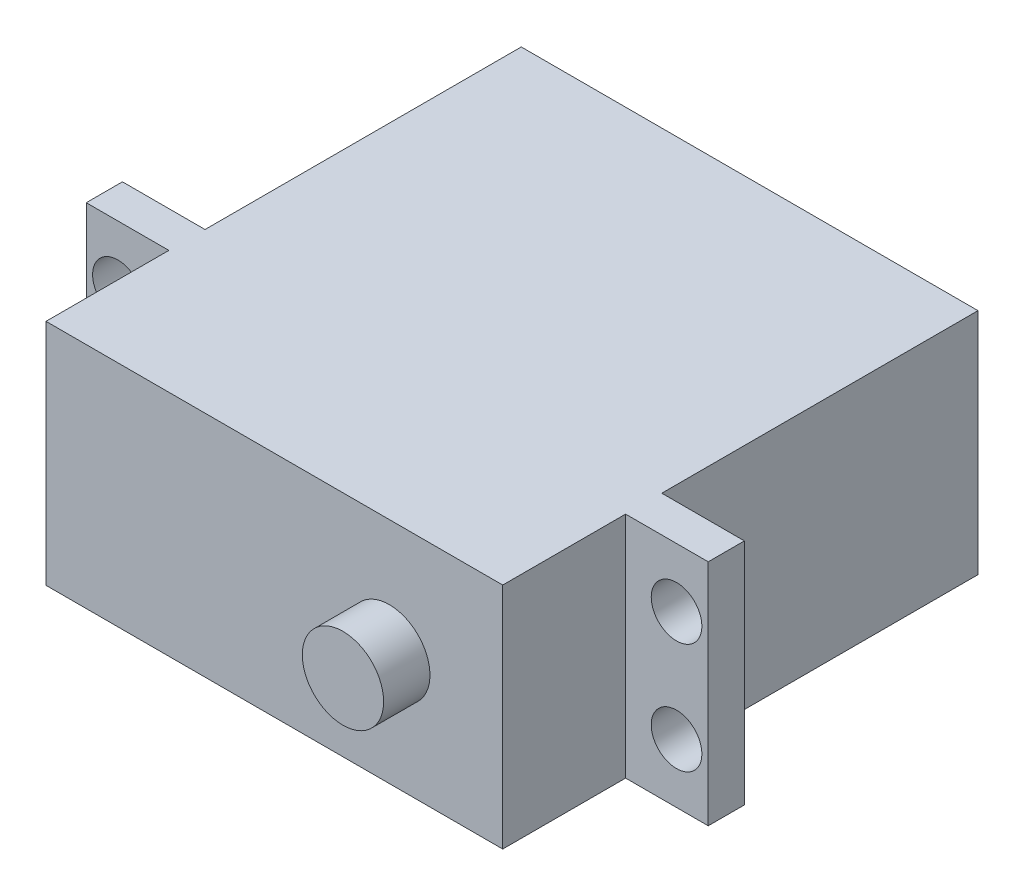
ISO-10303-21;
HEADER;
FILE_DESCRIPTION(('STEP AP214'),'2;1');
FILE_NAME('part.step','',(''),(''),'','','');
FILE_SCHEMA(('AUTOMOTIVE_DESIGN { 1 0 10303 214 1 1 1 1 }'));
ENDSEC;
DATA;
#1=APPLICATION_CONTEXT('core data for automotive mechanical design processes');
#2=APPLICATION_PROTOCOL_DEFINITION('international standard','automotive_design',2000,#1);
#3=PRODUCT_CONTEXT('',#1,'mechanical');
#4=PRODUCT('Part','Part','',(#3));
#5=PRODUCT_RELATED_PRODUCT_CATEGORY('part','',(#4));
#6=PRODUCT_DEFINITION_FORMATION('','',#4);
#7=PRODUCT_DEFINITION_CONTEXT('part definition',#1,'design');
#8=PRODUCT_DEFINITION('design','',#6,#7);
#9=PRODUCT_DEFINITION_SHAPE('','',#8);
#10=(LENGTH_UNIT() NAMED_UNIT(*) SI_UNIT(.MILLI.,.METRE.));
#11=(NAMED_UNIT(*) PLANE_ANGLE_UNIT() SI_UNIT($,.RADIAN.));
#12=(NAMED_UNIT(*) SI_UNIT($,.STERADIAN.) SOLID_ANGLE_UNIT());
#13=UNCERTAINTY_MEASURE_WITH_UNIT(LENGTH_MEASURE(1.E-05),#10,'distance_accuracy_value','');
#14=(GEOMETRIC_REPRESENTATION_CONTEXT(3) GLOBAL_UNCERTAINTY_ASSIGNED_CONTEXT((#13)) GLOBAL_UNIT_ASSIGNED_CONTEXT((#10,
#11,#12)) REPRESENTATION_CONTEXT('',''));
#15=CARTESIAN_POINT('',(0.,0.,0.));
#16=DIRECTION('',(0.,0.,1.));
#17=DIRECTION('',(1.,0.,0.));
#18=AXIS2_PLACEMENT_3D('',#15,#16,#17);
#19=CARTESIAN_POINT('',(0.,0.,41.7068));
#20=DIRECTION('',(1.,0.,0.));
#21=DIRECTION('',(0.,0.,-1.));
#22=AXIS2_PLACEMENT_3D('',#19,#20,#21);
#23=PLANE('',#22);
#24=DIRECTION('',(0.,0.,-1.));
#25=VECTOR('',#24,1.);
#26=CARTESIAN_POINT('',(0.,20.066,41.7068));
#27=LINE('',#26,#25);
#28=CARTESIAN_POINT('',(0.,20.066,41.7068));
#29=VERTEX_POINT('',#28);
#30=CARTESIAN_POINT('',(0.,20.066,30.9245));
#31=VERTEX_POINT('',#30);
#32=EDGE_CURVE('E208',#29,#31,#27,.T.);
#33=ORIENTED_EDGE('',*,*,#32,.T.);
#34=DIRECTION('',(0.,-1.,0.));
#35=VECTOR('',#34,1.);
#36=CARTESIAN_POINT('',(0.,20.066,30.9245));
#37=LINE('',#36,#35);
#38=CARTESIAN_POINT('',(0.,0.,30.9245));
#39=VERTEX_POINT('',#38);
#40=EDGE_CURVE('E130',#31,#39,#37,.T.);
#41=ORIENTED_EDGE('',*,*,#40,.T.);
#42=DIRECTION('',(0.,0.,-1.));
#43=VECTOR('',#42,1.);
#44=CARTESIAN_POINT('',(0.,0.,41.7068));
#45=LINE('',#44,#43);
#46=CARTESIAN_POINT('',(0.,0.,41.7068));
#47=VERTEX_POINT('',#46);
#48=EDGE_CURVE('E42',#47,#39,#45,.T.);
#49=ORIENTED_EDGE('',*,*,#48,.F.);
#50=DIRECTION('',(0.,-1.,0.));
#51=VECTOR('',#50,1.);
#52=CARTESIAN_POINT('',(0.,0.,41.7068));
#53=LINE('',#52,#51);
#54=EDGE_CURVE('E188',#29,#47,#53,.T.);
#55=ORIENTED_EDGE('',*,*,#54,.F.);
#56=EDGE_LOOP('',(#33,#41,#49,#55));
#57=FACE_BOUND('',#56,.T.);
#58=ADVANCED_FACE('F34',(#57),#23,.F.);
#59=CARTESIAN_POINT('',(40.0812,0.,41.7068));
#60=DIRECTION('',(-1.,0.,0.));
#61=DIRECTION('',(0.,0.,1.));
#62=AXIS2_PLACEMENT_3D('',#59,#60,#61);
#63=PLANE('',#62);
#64=DIRECTION('',(0.,-1.,0.));
#65=VECTOR('',#64,1.);
#66=CARTESIAN_POINT('',(40.0812,20.066,30.9245));
#67=LINE('',#66,#65);
#68=CARTESIAN_POINT('',(40.0812,20.066,30.9245));
#69=VERTEX_POINT('',#68);
#70=CARTESIAN_POINT('',(40.0812,0.,30.9245));
#71=VERTEX_POINT('',#70);
#72=EDGE_CURVE('E135',#69,#71,#67,.T.);
#73=ORIENTED_EDGE('',*,*,#72,.F.);
#74=DIRECTION('',(0.,0.,-1.));
#75=VECTOR('',#74,1.);
#76=CARTESIAN_POINT('',(40.0812,20.066,41.7068));
#77=LINE('',#76,#75);
#78=CARTESIAN_POINT('',(40.0812,20.066,41.7068));
#79=VERTEX_POINT('',#78);
#80=EDGE_CURVE('E211',#79,#69,#77,.T.);
#81=ORIENTED_EDGE('',*,*,#80,.F.);
#82=DIRECTION('',(0.,1.,0.));
#83=VECTOR('',#82,1.);
#84=CARTESIAN_POINT('',(40.0812,0.,41.7068));
#85=LINE('',#84,#83);
#86=CARTESIAN_POINT('',(40.0812,0.,41.7068));
#87=VERTEX_POINT('',#86);
#88=EDGE_CURVE('E194',#87,#79,#85,.T.);
#89=ORIENTED_EDGE('',*,*,#88,.F.);
#90=DIRECTION('',(0.,0.,-1.));
#91=VECTOR('',#90,1.);
#92=CARTESIAN_POINT('',(40.0812,0.,41.7068));
#93=LINE('',#92,#91);
#94=EDGE_CURVE('E215',#87,#71,#93,.T.);
#95=ORIENTED_EDGE('',*,*,#94,.T.);
#96=EDGE_LOOP('',(#73,#81,#89,#95));
#97=FACE_BOUND('',#96,.T.);
#98=ADVANCED_FACE('F247',(#97),#63,.F.);
#99=DIRECTION('',(0.,1.,0.));
#100=VECTOR('',#99,1.);
#101=CARTESIAN_POINT('',(40.0812,20.066,27.7495));
#102=LINE('',#101,#100);
#103=CARTESIAN_POINT('',(40.0812,0.,27.7495));
#104=VERTEX_POINT('',#103);
#105=CARTESIAN_POINT('',(40.0812,20.066,27.7495));
#106=VERTEX_POINT('',#105);
#107=EDGE_CURVE('E57',#104,#106,#102,.T.);
#108=ORIENTED_EDGE('',*,*,#107,.F.);
#109=CARTESIAN_POINT('',(40.0812,0.,0.));
#110=VERTEX_POINT('',#109);
#111=EDGE_CURVE('E214',#104,#110,#93,.T.);
#112=ORIENTED_EDGE('',*,*,#111,.T.);
#113=DIRECTION('',(0.,1.,0.));
#114=VECTOR('',#113,1.);
#115=CARTESIAN_POINT('',(40.0812,0.,0.));
#116=LINE('',#115,#114);
#117=CARTESIAN_POINT('',(40.0812,20.066,0.));
#118=VERTEX_POINT('',#117);
#119=EDGE_CURVE('E204',#110,#118,#116,.T.);
#120=ORIENTED_EDGE('',*,*,#119,.T.);
#121=EDGE_CURVE('E210',#106,#118,#77,.T.);
#122=ORIENTED_EDGE('',*,*,#121,.F.);
#123=EDGE_LOOP('',(#108,#112,#120,#122));
#124=FACE_BOUND('',#123,.T.);
#125=ADVANCED_FACE('F231',(#124),#63,.F.);
#126=CARTESIAN_POINT('',(0.,0.,27.7495));
#127=VERTEX_POINT('',#126);
#128=CARTESIAN_POINT('',(0.,0.,0.));
#129=VERTEX_POINT('',#128);
#130=EDGE_CURVE('E216',#127,#129,#45,.T.);
#131=ORIENTED_EDGE('',*,*,#130,.F.);
#132=DIRECTION('',(0.,1.,0.));
#133=VECTOR('',#132,1.);
#134=CARTESIAN_POINT('',(0.,20.066,27.7495));
#135=LINE('',#134,#133);
#136=CARTESIAN_POINT('',(0.,20.066,27.7495));
#137=VERTEX_POINT('',#136);
#138=EDGE_CURVE('E144',#127,#137,#135,.T.);
#139=ORIENTED_EDGE('',*,*,#138,.T.);
#140=CARTESIAN_POINT('',(0.,20.066,0.));
#141=VERTEX_POINT('',#140);
#142=EDGE_CURVE('E198',#137,#141,#27,.T.);
#143=ORIENTED_EDGE('',*,*,#142,.T.);
#144=DIRECTION('',(0.,-1.,0.));
#145=VECTOR('',#144,1.);
#146=CARTESIAN_POINT('',(0.,0.,0.));
#147=LINE('',#146,#145);
#148=EDGE_CURVE('E187',#141,#129,#147,.T.);
#149=ORIENTED_EDGE('',*,*,#148,.T.);
#150=EDGE_LOOP('',(#131,#139,#143,#149));
#151=FACE_BOUND('',#150,.T.);
#152=ADVANCED_FACE('F36',(#151),#23,.F.);
#153=CARTESIAN_POINT('',(0.,0.,41.7068));
#154=DIRECTION('',(0.,1.,0.));
#155=DIRECTION('',(0.,0.,1.));
#156=AXIS2_PLACEMENT_3D('',#153,#154,#155);
#157=PLANE('',#156);
#158=DIRECTION('',(1.,0.,0.));
#159=VECTOR('',#158,1.);
#160=CARTESIAN_POINT('',(0.,0.,0.));
#161=LINE('',#160,#159);
#162=EDGE_CURVE('E201',#129,#110,#161,.T.);
#163=ORIENTED_EDGE('',*,*,#162,.T.);
#164=ORIENTED_EDGE('',*,*,#111,.F.);
#165=DIRECTION('',(-1.,0.,0.));
#166=VECTOR('',#165,1.);
#167=CARTESIAN_POINT('',(47.3312,0.,27.7495));
#168=LINE('',#167,#166);
#169=CARTESIAN_POINT('',(47.3312,0.,27.7495));
#170=VERTEX_POINT('',#169);
#171=EDGE_CURVE('E181',#170,#104,#168,.T.);
#172=ORIENTED_EDGE('',*,*,#171,.F.);
#173=DIRECTION('',(0.,0.,-1.));
#174=VECTOR('',#173,1.);
#175=CARTESIAN_POINT('',(47.3312,0.,30.9245));
#176=LINE('',#175,#174);
#177=CARTESIAN_POINT('',(47.3312,0.,30.9245));
#178=VERTEX_POINT('',#177);
#179=EDGE_CURVE('E166',#178,#170,#176,.T.);
#180=ORIENTED_EDGE('',*,*,#179,.F.);
#181=DIRECTION('',(-1.,0.,0.));
#182=VECTOR('',#181,1.);
#183=CARTESIAN_POINT('',(47.3312,0.,30.9245));
#184=LINE('',#183,#182);
#185=EDGE_CURVE('E184',#178,#71,#184,.T.);
#186=ORIENTED_EDGE('',*,*,#185,.T.);
#187=ORIENTED_EDGE('',*,*,#94,.F.);
#188=DIRECTION('',(1.,0.,0.));
#189=VECTOR('',#188,1.);
#190=CARTESIAN_POINT('',(0.,0.,41.7068));
#191=LINE('',#190,#189);
#192=EDGE_CURVE('E191',#47,#87,#191,.T.);
#193=ORIENTED_EDGE('',*,*,#192,.F.);
#194=ORIENTED_EDGE('',*,*,#48,.T.);
#195=DIRECTION('',(1.,0.,0.));
#196=VECTOR('',#195,1.);
#197=CARTESIAN_POINT('',(-7.25,0.,30.9245));
#198=LINE('',#197,#196);
#199=CARTESIAN_POINT('',(-7.25,0.,30.9245));
#200=VERTEX_POINT('',#199);
#201=EDGE_CURVE('E155',#200,#39,#198,.T.);
#202=ORIENTED_EDGE('',*,*,#201,.F.);
#203=DIRECTION('',(0.,0.,-1.));
#204=VECTOR('',#203,1.);
#205=CARTESIAN_POINT('',(-7.25,0.,30.9245));
#206=LINE('',#205,#204);
#207=CARTESIAN_POINT('',(-7.25,0.,27.7495));
#208=VERTEX_POINT('',#207);
#209=EDGE_CURVE('E143',#200,#208,#206,.T.);
#210=ORIENTED_EDGE('',*,*,#209,.T.);
#211=DIRECTION('',(1.,0.,0.));
#212=VECTOR('',#211,1.);
#213=CARTESIAN_POINT('',(-7.25,0.,27.7495));
#214=LINE('',#213,#212);
#215=EDGE_CURVE('E160',#208,#127,#214,.T.);
#216=ORIENTED_EDGE('',*,*,#215,.T.);
#217=ORIENTED_EDGE('',*,*,#130,.T.);
#218=EDGE_LOOP('',(#163,#164,#172,#180,#186,#187,#193,#194,#202,#210,#216,#217));
#219=FACE_BOUND('',#218,.T.);
#220=ADVANCED_FACE('F222',(#219),#157,.F.);
#221=CARTESIAN_POINT('',(0.,20.066,41.7068));
#222=DIRECTION('',(0.,-1.,0.));
#223=DIRECTION('',(0.,0.,-1.));
#224=AXIS2_PLACEMENT_3D('',#221,#222,#223);
#225=PLANE('',#224);
#226=DIRECTION('',(-1.,0.,0.));
#227=VECTOR('',#226,1.);
#228=CARTESIAN_POINT('',(0.,20.066,0.));
#229=LINE('',#228,#227);
#230=EDGE_CURVE('E192',#118,#141,#229,.T.);
#231=ORIENTED_EDGE('',*,*,#230,.T.);
#232=ORIENTED_EDGE('',*,*,#142,.F.);
#233=DIRECTION('',(1.,0.,0.));
#234=VECTOR('',#233,1.);
#235=CARTESIAN_POINT('',(-7.25,20.066,27.7495));
#236=LINE('',#235,#234);
#237=CARTESIAN_POINT('',(-7.25,20.066,27.7495));
#238=VERTEX_POINT('',#237);
#239=EDGE_CURVE('E49',#238,#137,#236,.T.);
#240=ORIENTED_EDGE('',*,*,#239,.F.);
#241=DIRECTION('',(0.,0.,1.));
#242=VECTOR('',#241,1.);
#243=CARTESIAN_POINT('',(-7.25,20.066,30.9245));
#244=LINE('',#243,#242);
#245=CARTESIAN_POINT('',(-7.25,20.066,30.9245));
#246=VERTEX_POINT('',#245);
#247=EDGE_CURVE('E141',#238,#246,#244,.T.);
#248=ORIENTED_EDGE('',*,*,#247,.T.);
#249=DIRECTION('',(1.,0.,0.));
#250=VECTOR('',#249,1.);
#251=CARTESIAN_POINT('',(-7.25,20.066,30.9245));
#252=LINE('',#251,#250);
#253=EDGE_CURVE('E124',#246,#31,#252,.T.);
#254=ORIENTED_EDGE('',*,*,#253,.T.);
#255=ORIENTED_EDGE('',*,*,#32,.F.);
#256=DIRECTION('',(-1.,0.,0.));
#257=VECTOR('',#256,1.);
#258=CARTESIAN_POINT('',(0.,20.066,41.7068));
#259=LINE('',#258,#257);
#260=EDGE_CURVE('E196',#79,#29,#259,.T.);
#261=ORIENTED_EDGE('',*,*,#260,.F.);
#262=ORIENTED_EDGE('',*,*,#80,.T.);
#263=DIRECTION('',(-1.,0.,0.));
#264=VECTOR('',#263,1.);
#265=CARTESIAN_POINT('',(47.3312,20.066,30.9245));
#266=LINE('',#265,#264);
#267=CARTESIAN_POINT('',(47.3312,20.066,30.9245));
#268=VERTEX_POINT('',#267);
#269=EDGE_CURVE('E172',#268,#69,#266,.T.);
#270=ORIENTED_EDGE('',*,*,#269,.F.);
#271=DIRECTION('',(0.,0.,1.));
#272=VECTOR('',#271,1.);
#273=CARTESIAN_POINT('',(47.3312,20.066,30.9245));
#274=LINE('',#273,#272);
#275=CARTESIAN_POINT('',(47.3312,20.066,27.7495));
#276=VERTEX_POINT('',#275);
#277=EDGE_CURVE('E170',#276,#268,#274,.T.);
#278=ORIENTED_EDGE('',*,*,#277,.F.);
#279=DIRECTION('',(-1.,0.,0.));
#280=VECTOR('',#279,1.);
#281=CARTESIAN_POINT('',(47.3312,20.066,27.7495));
#282=LINE('',#281,#280);
#283=EDGE_CURVE('E178',#276,#106,#282,.T.);
#284=ORIENTED_EDGE('',*,*,#283,.T.);
#285=ORIENTED_EDGE('',*,*,#121,.T.);
#286=EDGE_LOOP('',(#231,#232,#240,#248,#254,#255,#261,#262,#270,#278,#284,#285));
#287=FACE_BOUND('',#286,.T.);
#288=ADVANCED_FACE('F147',(#287),#225,.F.);
#289=CARTESIAN_POINT('',(0.,0.,41.7068));
#290=DIRECTION('',(0.,0.,-1.));
#291=DIRECTION('',(-1.,0.,0.));
#292=AXIS2_PLACEMENT_3D('',#289,#290,#291);
#293=PLANE('',#292);
#294=CARTESIAN_POINT('',(30.1244,10.033,41.7068));
#295=DIRECTION('',(0.,0.,-1.));
#296=DIRECTION('',(-1.,0.,0.));
#297=AXIS2_PLACEMENT_3D('',#294,#295,#296);
#298=CIRCLE('',#297,3.5687);
#299=CARTESIAN_POINT('',(26.5557,10.033,41.7068));
#300=VERTEX_POINT('',#299);
#301=EDGE_CURVE('E11',#300,#300,#298,.F.);
#302=ORIENTED_EDGE('',*,*,#301,.F.);
#303=EDGE_LOOP('',(#302));
#304=FACE_BOUND('',#303,.T.);
#305=ORIENTED_EDGE('',*,*,#54,.T.);
#306=ORIENTED_EDGE('',*,*,#192,.T.);
#307=ORIENTED_EDGE('',*,*,#88,.T.);
#308=ORIENTED_EDGE('',*,*,#260,.T.);
#309=EDGE_LOOP('',(#305,#306,#307,#308));
#310=FACE_BOUND('',#309,.T.);
#311=ADVANCED_FACE('F251',(#304,#310),#293,.F.);
#312=CARTESIAN_POINT('',(0.,0.,0.));
#313=DIRECTION('',(0.,0.,-1.));
#314=DIRECTION('',(-1.,0.,0.));
#315=AXIS2_PLACEMENT_3D('',#312,#313,#314);
#316=PLANE('',#315);
#317=ORIENTED_EDGE('',*,*,#148,.F.);
#318=ORIENTED_EDGE('',*,*,#230,.F.);
#319=ORIENTED_EDGE('',*,*,#119,.F.);
#320=ORIENTED_EDGE('',*,*,#162,.F.);
#321=EDGE_LOOP('',(#317,#318,#319,#320));
#322=FACE_BOUND('',#321,.T.);
#323=ADVANCED_FACE('F227',(#322),#316,.T.);
#324=CARTESIAN_POINT('',(47.3312,20.066,30.9245));
#325=DIRECTION('',(0.,0.,-1.));
#326=DIRECTION('',(0.,1.,0.));
#327=AXIS2_PLACEMENT_3D('',#324,#325,#326);
#328=PLANE('',#327);
#329=CARTESIAN_POINT('',(44.5516,14.8844,30.9245));
#330=DIRECTION('',(0.,0.,1.));
#331=DIRECTION('',(-1.,0.,0.));
#332=AXIS2_PLACEMENT_3D('',#329,#330,#331);
#333=CIRCLE('',#332,2.2225);
#334=CARTESIAN_POINT('',(42.3291,14.8844,30.9245));
#335=VERTEX_POINT('',#334);
#336=EDGE_CURVE('E332',#335,#335,#333,.T.);
#337=ORIENTED_EDGE('',*,*,#336,.F.);
#338=EDGE_LOOP('',(#337));
#339=FACE_BOUND('',#338,.T.);
#340=CARTESIAN_POINT('',(44.5516,5.1816,30.9245));
#341=DIRECTION('',(0.,0.,1.));
#342=DIRECTION('',(1.,0.,0.));
#343=AXIS2_PLACEMENT_3D('',#340,#341,#342);
#344=CIRCLE('',#343,2.2225);
#345=CARTESIAN_POINT('',(46.7741,5.1816,30.9245));
#346=VERTEX_POINT('',#345);
#347=EDGE_CURVE('E327',#346,#346,#344,.T.);
#348=ORIENTED_EDGE('',*,*,#347,.F.);
#349=EDGE_LOOP('',(#348));
#350=FACE_BOUND('',#349,.T.);
#351=ORIENTED_EDGE('',*,*,#72,.T.);
#352=ORIENTED_EDGE('',*,*,#185,.F.);
#353=DIRECTION('',(0.,-1.,0.));
#354=VECTOR('',#353,1.);
#355=CARTESIAN_POINT('',(47.3312,20.066,30.9245));
#356=LINE('',#355,#354);
#357=EDGE_CURVE('E163',#268,#178,#356,.T.);
#358=ORIENTED_EDGE('',*,*,#357,.F.);
#359=ORIENTED_EDGE('',*,*,#269,.T.);
#360=EDGE_LOOP('',(#351,#352,#358,#359));
#361=FACE_BOUND('',#360,.T.);
#362=ADVANCED_FACE('F244',(#339,#350,#361),#328,.F.);
#363=CARTESIAN_POINT('',(47.3312,20.066,27.7495));
#364=DIRECTION('',(0.,0.,1.));
#365=DIRECTION('',(1.,0.,0.));
#366=AXIS2_PLACEMENT_3D('',#363,#364,#365);
#367=PLANE('',#366);
#368=CARTESIAN_POINT('',(44.5516,14.8844,27.7495));
#369=DIRECTION('',(0.,0.,1.));
#370=DIRECTION('',(1.,0.,0.));
#371=AXIS2_PLACEMENT_3D('',#368,#369,#370);
#372=CIRCLE('',#371,2.2225);
#373=CARTESIAN_POINT('',(46.7741,14.8844,27.7495));
#374=VERTEX_POINT('',#373);
#375=EDGE_CURVE('E331',#374,#374,#372,.F.);
#376=ORIENTED_EDGE('',*,*,#375,.F.);
#377=EDGE_LOOP('',(#376));
#378=FACE_BOUND('',#377,.T.);
#379=CARTESIAN_POINT('',(44.5516,5.1816,27.7495));
#380=DIRECTION('',(0.,0.,1.));
#381=DIRECTION('',(1.,0.,0.));
#382=AXIS2_PLACEMENT_3D('',#379,#380,#381);
#383=CIRCLE('',#382,2.2225);
#384=CARTESIAN_POINT('',(46.7741,5.1816,27.7495));
#385=VERTEX_POINT('',#384);
#386=EDGE_CURVE('E157',#385,#385,#383,.F.);
#387=ORIENTED_EDGE('',*,*,#386,.F.);
#388=EDGE_LOOP('',(#387));
#389=FACE_BOUND('',#388,.T.);
#390=ORIENTED_EDGE('',*,*,#107,.T.);
#391=ORIENTED_EDGE('',*,*,#283,.F.);
#392=DIRECTION('',(0.,1.,0.));
#393=VECTOR('',#392,1.);
#394=CARTESIAN_POINT('',(47.3312,20.066,27.7495));
#395=LINE('',#394,#393);
#396=EDGE_CURVE('E168',#170,#276,#395,.T.);
#397=ORIENTED_EDGE('',*,*,#396,.F.);
#398=ORIENTED_EDGE('',*,*,#171,.T.);
#399=EDGE_LOOP('',(#390,#391,#397,#398));
#400=FACE_BOUND('',#399,.T.);
#401=ADVANCED_FACE('F235',(#378,#389,#400),#367,.F.);
#402=CARTESIAN_POINT('',(47.3312,0.,0.));
#403=DIRECTION('',(1.,0.,0.));
#404=DIRECTION('',(0.,0.,-1.));
#405=AXIS2_PLACEMENT_3D('',#402,#403,#404);
#406=PLANE('',#405);
#407=ORIENTED_EDGE('',*,*,#357,.T.);
#408=ORIENTED_EDGE('',*,*,#179,.T.);
#409=ORIENTED_EDGE('',*,*,#396,.T.);
#410=ORIENTED_EDGE('',*,*,#277,.T.);
#411=EDGE_LOOP('',(#407,#408,#409,#410));
#412=FACE_BOUND('',#411,.T.);
#413=ADVANCED_FACE('F237',(#412),#406,.T.);
#414=CARTESIAN_POINT('',(-7.25,20.066,30.9245));
#415=DIRECTION('',(0.,0.,1.));
#416=DIRECTION('',(0.,-1.,0.));
#417=AXIS2_PLACEMENT_3D('',#414,#415,#416);
#418=PLANE('',#417);
#419=CARTESIAN_POINT('',(-4.4704,5.1816,30.9245));
#420=DIRECTION('',(0.,0.,1.));
#421=DIRECTION('',(-1.,0.,0.));
#422=AXIS2_PLACEMENT_3D('',#419,#420,#421);
#423=CIRCLE('',#422,2.2225);
#424=CARTESIAN_POINT('',(-6.6929,5.1816,30.9245));
#425=VERTEX_POINT('',#424);
#426=EDGE_CURVE('E321',#425,#425,#423,.T.);
#427=ORIENTED_EDGE('',*,*,#426,.F.);
#428=EDGE_LOOP('',(#427));
#429=FACE_BOUND('',#428,.T.);
#430=CARTESIAN_POINT('',(-4.4704,14.8844,30.9245));
#431=DIRECTION('',(0.,0.,1.));
#432=DIRECTION('',(1.,0.,0.));
#433=AXIS2_PLACEMENT_3D('',#430,#431,#432);
#434=CIRCLE('',#433,2.2225);
#435=CARTESIAN_POINT('',(-2.2479,14.8844,30.9245));
#436=VERTEX_POINT('',#435);
#437=EDGE_CURVE('E324',#436,#436,#434,.T.);
#438=ORIENTED_EDGE('',*,*,#437,.F.);
#439=EDGE_LOOP('',(#438));
#440=FACE_BOUND('',#439,.T.);
#441=ORIENTED_EDGE('',*,*,#40,.F.);
#442=ORIENTED_EDGE('',*,*,#253,.F.);
#443=DIRECTION('',(0.,-1.,0.));
#444=VECTOR('',#443,1.);
#445=CARTESIAN_POINT('',(-7.25,20.066,30.9245));
#446=LINE('',#445,#444);
#447=EDGE_CURVE('E127',#246,#200,#446,.T.);
#448=ORIENTED_EDGE('',*,*,#447,.T.);
#449=ORIENTED_EDGE('',*,*,#201,.T.);
#450=EDGE_LOOP('',(#441,#442,#448,#449));
#451=FACE_BOUND('',#450,.T.);
#452=ADVANCED_FACE('F126',(#429,#440,#451),#418,.T.);
#453=CARTESIAN_POINT('',(-7.25,20.066,27.7495));
#454=DIRECTION('',(0.,0.,-1.));
#455=DIRECTION('',(-1.,0.,0.));
#456=AXIS2_PLACEMENT_3D('',#453,#454,#455);
#457=PLANE('',#456);
#458=CARTESIAN_POINT('',(-4.4704,5.1816,27.7495));
#459=DIRECTION('',(0.,0.,-1.));
#460=DIRECTION('',(-1.,0.,0.));
#461=AXIS2_PLACEMENT_3D('',#458,#459,#460);
#462=CIRCLE('',#461,2.2225);
#463=CARTESIAN_POINT('',(-6.6929,5.1816,27.7495));
#464=VERTEX_POINT('',#463);
#465=EDGE_CURVE('E318',#464,#464,#462,.F.);
#466=ORIENTED_EDGE('',*,*,#465,.T.);
#467=EDGE_LOOP('',(#466));
#468=FACE_BOUND('',#467,.T.);
#469=CARTESIAN_POINT('',(-4.4704,14.8844,27.7495));
#470=DIRECTION('',(0.,0.,-1.));
#471=DIRECTION('',(-1.,0.,0.));
#472=AXIS2_PLACEMENT_3D('',#469,#470,#471);
#473=CIRCLE('',#472,2.2225);
#474=CARTESIAN_POINT('',(-6.6929,14.8844,27.7495));
#475=VERTEX_POINT('',#474);
#476=EDGE_CURVE('E328',#475,#475,#473,.F.);
#477=ORIENTED_EDGE('',*,*,#476,.T.);
#478=EDGE_LOOP('',(#477));
#479=FACE_BOUND('',#478,.T.);
#480=ORIENTED_EDGE('',*,*,#138,.F.);
#481=ORIENTED_EDGE('',*,*,#215,.F.);
#482=DIRECTION('',(0.,1.,0.));
#483=VECTOR('',#482,1.);
#484=CARTESIAN_POINT('',(-7.25,20.066,27.7495));
#485=LINE('',#484,#483);
#486=EDGE_CURVE('E149',#208,#238,#485,.T.);
#487=ORIENTED_EDGE('',*,*,#486,.T.);
#488=ORIENTED_EDGE('',*,*,#239,.T.);
#489=EDGE_LOOP('',(#480,#481,#487,#488));
#490=FACE_BOUND('',#489,.T.);
#491=ADVANCED_FACE('F283',(#468,#479,#490),#457,.T.);
#492=CARTESIAN_POINT('',(-7.25,0.,0.));
#493=DIRECTION('',(-1.,0.,0.));
#494=DIRECTION('',(0.,0.,-1.));
#495=AXIS2_PLACEMENT_3D('',#492,#493,#494);
#496=PLANE('',#495);
#497=ORIENTED_EDGE('',*,*,#447,.F.);
#498=ORIENTED_EDGE('',*,*,#247,.F.);
#499=ORIENTED_EDGE('',*,*,#486,.F.);
#500=ORIENTED_EDGE('',*,*,#209,.F.);
#501=EDGE_LOOP('',(#497,#498,#499,#500));
#502=FACE_BOUND('',#501,.T.);
#503=ADVANCED_FACE('F139',(#502),#496,.T.);
#504=CARTESIAN_POINT('',(-4.4704,14.8844,-0.001000000000001));
#505=DIRECTION('',(0.,0.,1.));
#506=DIRECTION('',(1.,0.,0.));
#507=AXIS2_PLACEMENT_3D('',#504,#505,#506);
#508=CYLINDRICAL_SURFACE('',#507,2.2225);
#509=ORIENTED_EDGE('',*,*,#476,.F.);
#510=EDGE_LOOP('',(#509));
#511=FACE_BOUND('',#510,.T.);
#512=ORIENTED_EDGE('',*,*,#437,.T.);
#513=EDGE_LOOP('',(#512));
#514=FACE_BOUND('',#513,.T.);
#515=ADVANCED_FACE('F290',(#511,#514),#508,.F.);
#516=CARTESIAN_POINT('',(-4.4704,5.1816,-0.001000000000001));
#517=DIRECTION('',(0.,0.,1.));
#518=DIRECTION('',(1.,0.,0.));
#519=AXIS2_PLACEMENT_3D('',#516,#517,#518);
#520=CYLINDRICAL_SURFACE('',#519,2.2225);
#521=ORIENTED_EDGE('',*,*,#465,.F.);
#522=EDGE_LOOP('',(#521));
#523=FACE_BOUND('',#522,.T.);
#524=ORIENTED_EDGE('',*,*,#426,.T.);
#525=EDGE_LOOP('',(#524));
#526=FACE_BOUND('',#525,.T.);
#527=ADVANCED_FACE('F295',(#523,#526),#520,.F.);
#528=CARTESIAN_POINT('',(44.5516,5.1816,-0.001000000000001));
#529=DIRECTION('',(0.,0.,1.));
#530=DIRECTION('',(1.,0.,0.));
#531=AXIS2_PLACEMENT_3D('',#528,#529,#530);
#532=CYLINDRICAL_SURFACE('',#531,2.2225);
#533=ORIENTED_EDGE('',*,*,#347,.T.);
#534=EDGE_LOOP('',(#533));
#535=FACE_BOUND('',#534,.T.);
#536=ORIENTED_EDGE('',*,*,#386,.T.);
#537=EDGE_LOOP('',(#536));
#538=FACE_BOUND('',#537,.T.);
#539=ADVANCED_FACE('F291',(#535,#538),#532,.F.);
#540=CARTESIAN_POINT('',(44.5516,14.8844,-0.001000000000001));
#541=DIRECTION('',(0.,0.,1.));
#542=DIRECTION('',(1.,0.,0.));
#543=AXIS2_PLACEMENT_3D('',#540,#541,#542);
#544=CYLINDRICAL_SURFACE('',#543,2.2225);
#545=ORIENTED_EDGE('',*,*,#336,.T.);
#546=EDGE_LOOP('',(#545));
#547=FACE_BOUND('',#546,.T.);
#548=ORIENTED_EDGE('',*,*,#375,.T.);
#549=EDGE_LOOP('',(#548));
#550=FACE_BOUND('',#549,.T.);
#551=ADVANCED_FACE('F294',(#547,#550),#544,.F.);
#552=CARTESIAN_POINT('',(30.1244,10.033,45.7708));
#553=DIRECTION('',(0.,0.,-1.));
#554=DIRECTION('',(-1.,0.,0.));
#555=AXIS2_PLACEMENT_3D('',#552,#553,#554);
#556=CYLINDRICAL_SURFACE('',#555,3.5687);
#557=CARTESIAN_POINT('',(30.1244,10.033,45.7708));
#558=DIRECTION('',(0.,0.,1.));
#559=DIRECTION('',(1.,0.,0.));
#560=AXIS2_PLACEMENT_3D('',#557,#558,#559);
#561=CIRCLE('',#560,3.5687);
#562=CARTESIAN_POINT('',(33.6931,10.033,45.7708));
#563=VERTEX_POINT('',#562);
#564=EDGE_CURVE('E317',#563,#563,#561,.T.);
#565=ORIENTED_EDGE('',*,*,#564,.F.);
#566=EDGE_LOOP('',(#565));
#567=FACE_BOUND('',#566,.T.);
#568=ORIENTED_EDGE('',*,*,#301,.T.);
#569=EDGE_LOOP('',(#568));
#570=FACE_BOUND('',#569,.T.);
#571=ADVANCED_FACE('F302',(#567,#570),#556,.T.);
#572=CARTESIAN_POINT('',(30.1244,10.033,45.7708));
#573=DIRECTION('',(0.,0.,1.));
#574=DIRECTION('',(1.,0.,0.));
#575=AXIS2_PLACEMENT_3D('',#572,#573,#574);
#576=PLANE('',#575);
#577=ORIENTED_EDGE('',*,*,#564,.T.);
#578=EDGE_LOOP('',(#577));
#579=FACE_BOUND('',#578,.T.);
#580=ADVANCED_FACE('F309',(#579),#576,.T.);
#581=CLOSED_SHELL('',(#58,#98,#125,#152,#220,#288,#311,#323,#362,#401,#413,#452,#491,#503,#515,
#527,#539,#551,#571,#580));
#582=MANIFOLD_SOLID_BREP('B2',#581);
#583=ADVANCED_BREP_SHAPE_REPRESENTATION('',(#18,#582),#14);
#584=SHAPE_DEFINITION_REPRESENTATION(#9,#583);
ENDSEC;
END-ISO-10303-21;
